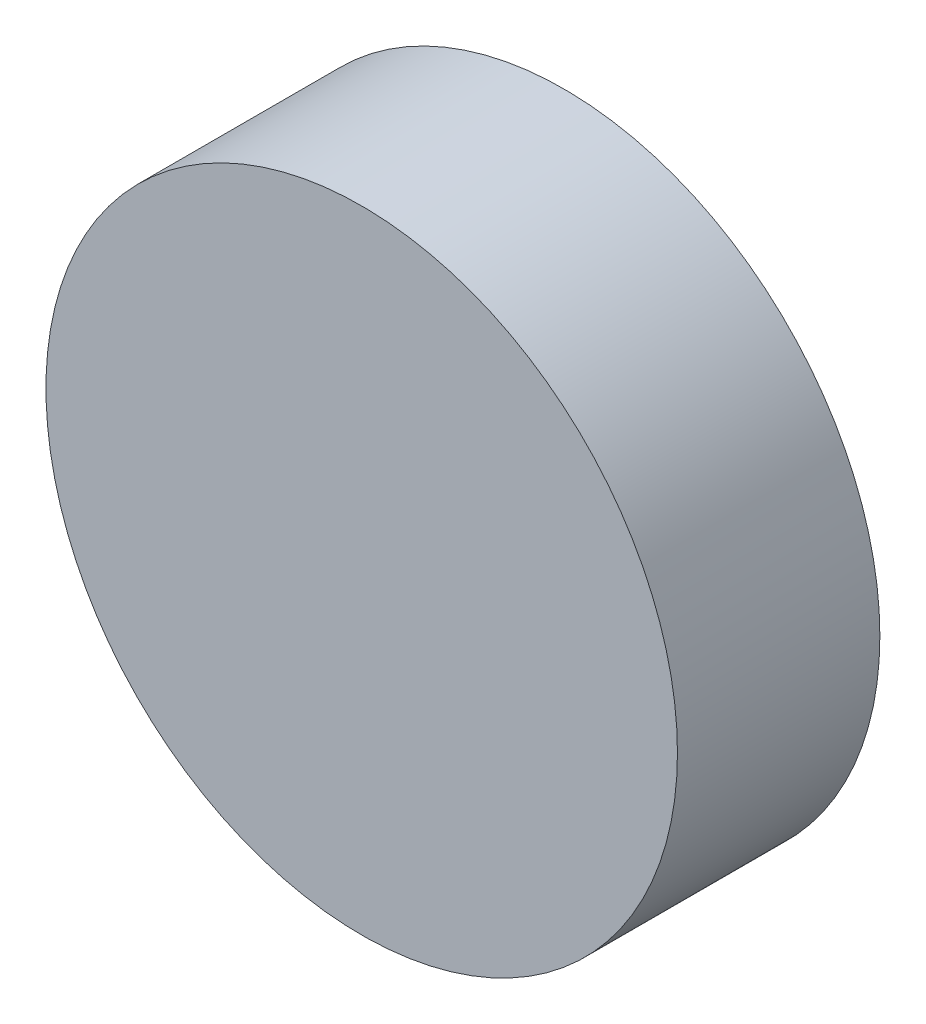
ISO-10303-21;
HEADER;
FILE_DESCRIPTION(('STEP AP214'),'2;1');
FILE_NAME('part.step','',(''),(''),'','','');
FILE_SCHEMA(('AUTOMOTIVE_DESIGN { 1 0 10303 214 1 1 1 1 }'));
ENDSEC;
DATA;
#1=APPLICATION_CONTEXT('core data for automotive mechanical design processes');
#2=APPLICATION_PROTOCOL_DEFINITION('international standard','automotive_design',2000,#1);
#3=PRODUCT_CONTEXT('',#1,'mechanical');
#4=PRODUCT('Part','Part','',(#3));
#5=PRODUCT_RELATED_PRODUCT_CATEGORY('part','',(#4));
#6=PRODUCT_DEFINITION_FORMATION('','',#4);
#7=PRODUCT_DEFINITION_CONTEXT('part definition',#1,'design');
#8=PRODUCT_DEFINITION('design','',#6,#7);
#9=PRODUCT_DEFINITION_SHAPE('','',#8);
#10=(LENGTH_UNIT() NAMED_UNIT(*) SI_UNIT(.MILLI.,.METRE.));
#11=(NAMED_UNIT(*) PLANE_ANGLE_UNIT() SI_UNIT($,.RADIAN.));
#12=(NAMED_UNIT(*) SI_UNIT($,.STERADIAN.) SOLID_ANGLE_UNIT());
#13=UNCERTAINTY_MEASURE_WITH_UNIT(LENGTH_MEASURE(1.E-05),#10,'distance_accuracy_value','');
#14=(GEOMETRIC_REPRESENTATION_CONTEXT(3) GLOBAL_UNCERTAINTY_ASSIGNED_CONTEXT((#13)) GLOBAL_UNIT_ASSIGNED_CONTEXT((#10,
#11,#12)) REPRESENTATION_CONTEXT('',''));
#15=CARTESIAN_POINT('',(0.,0.,0.));
#16=DIRECTION('',(0.,0.,1.));
#17=DIRECTION('',(1.,0.,0.));
#18=AXIS2_PLACEMENT_3D('',#15,#16,#17);
#19=CARTESIAN_POINT('',(0.,0.,20.));
#20=DIRECTION('',(0.,0.,-1.));
#21=DIRECTION('',(-1.,0.,0.));
#22=AXIS2_PLACEMENT_3D('',#19,#20,#21);
#23=CYLINDRICAL_SURFACE('',#22,31.2);
#24=CARTESIAN_POINT('',(0.,0.,20.));
#25=DIRECTION('',(0.,0.,1.));
#26=DIRECTION('',(1.,0.,0.));
#27=AXIS2_PLACEMENT_3D('',#24,#25,#26);
#28=CIRCLE('',#27,31.2);
#29=CARTESIAN_POINT('',(31.2,0.,20.));
#30=VERTEX_POINT('',#29);
#31=EDGE_CURVE('E10',#30,#30,#28,.T.);
#32=ORIENTED_EDGE('',*,*,#31,.F.);
#33=EDGE_LOOP('',(#32));
#34=FACE_BOUND('',#33,.T.);
#35=CARTESIAN_POINT('',(0.,0.,0.));
#36=DIRECTION('',(0.,0.,1.));
#37=DIRECTION('',(1.,0.,0.));
#38=AXIS2_PLACEMENT_3D('',#35,#36,#37);
#39=CIRCLE('',#38,31.2);
#40=CARTESIAN_POINT('',(31.2,0.,0.));
#41=VERTEX_POINT('',#40);
#42=EDGE_CURVE('E37',#41,#41,#39,.T.);
#43=ORIENTED_EDGE('',*,*,#42,.T.);
#44=EDGE_LOOP('',(#43));
#45=FACE_BOUND('',#44,.T.);
#46=ADVANCED_FACE('F40',(#34,#45),#23,.T.);
#47=CARTESIAN_POINT('',(0.,0.,20.));
#48=DIRECTION('',(0.,0.,1.));
#49=DIRECTION('',(1.,0.,0.));
#50=AXIS2_PLACEMENT_3D('',#47,#48,#49);
#51=PLANE('',#50);
#52=ORIENTED_EDGE('',*,*,#31,.T.);
#53=EDGE_LOOP('',(#52));
#54=FACE_BOUND('',#53,.T.);
#55=ADVANCED_FACE('F55',(#54),#51,.T.);
#56=CARTESIAN_POINT('',(0.,0.,0.));
#57=DIRECTION('',(0.,0.,1.));
#58=DIRECTION('',(1.,0.,0.));
#59=AXIS2_PLACEMENT_3D('',#56,#57,#58);
#60=PLANE('',#59);
#61=ORIENTED_EDGE('',*,*,#42,.F.);
#62=EDGE_LOOP('',(#61));
#63=FACE_BOUND('',#62,.T.);
#64=ADVANCED_FACE('F49',(#63),#60,.F.);
#65=CLOSED_SHELL('',(#46,#55,#64));
#66=MANIFOLD_SOLID_BREP('B2',#65);
#67=ADVANCED_BREP_SHAPE_REPRESENTATION('',(#18,#66),#14);
#68=SHAPE_DEFINITION_REPRESENTATION(#9,#67);
ENDSEC;
END-ISO-10303-21;
